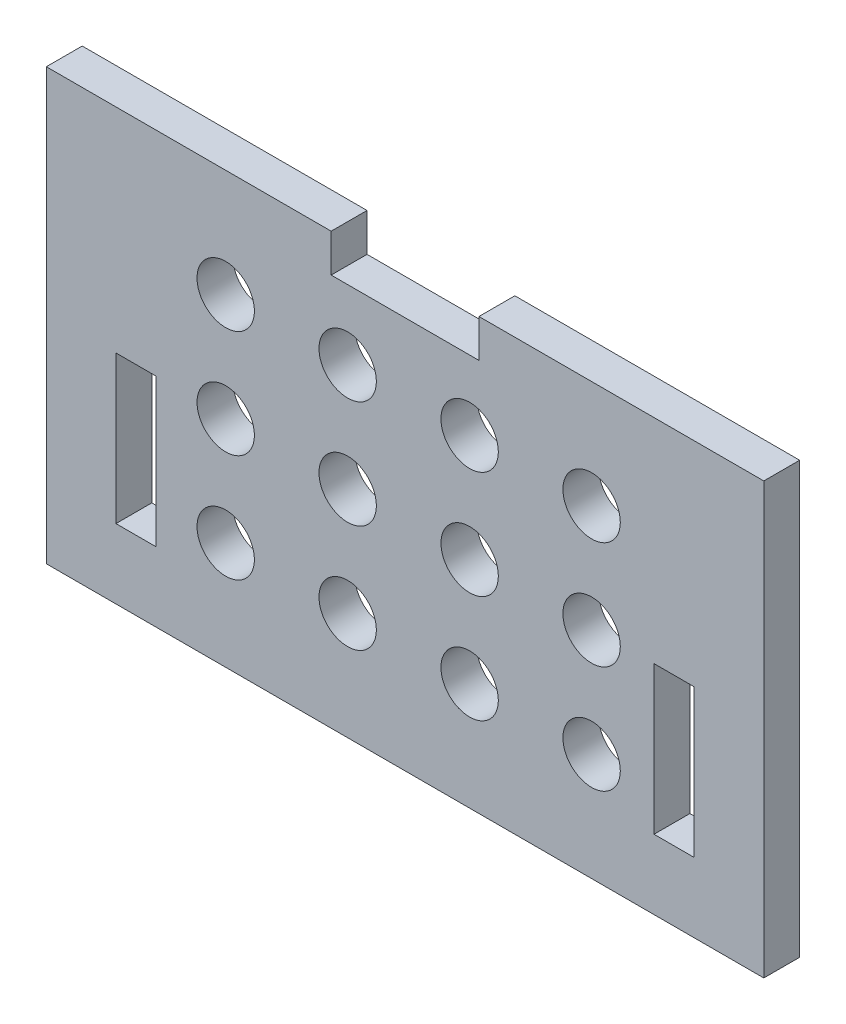
ISO-10303-21;
HEADER;
FILE_DESCRIPTION(('STEP AP214'),'2;1');
FILE_NAME('part.step','',(''),(''),'','','');
FILE_SCHEMA(('AUTOMOTIVE_DESIGN { 1 0 10303 214 1 1 1 1 }'));
ENDSEC;
DATA;
#1=APPLICATION_CONTEXT('core data for automotive mechanical design processes');
#2=APPLICATION_PROTOCOL_DEFINITION('international standard','automotive_design',2000,#1);
#3=PRODUCT_CONTEXT('',#1,'mechanical');
#4=PRODUCT('Part','Part','',(#3));
#5=PRODUCT_RELATED_PRODUCT_CATEGORY('part','',(#4));
#6=PRODUCT_DEFINITION_FORMATION('','',#4);
#7=PRODUCT_DEFINITION_CONTEXT('part definition',#1,'design');
#8=PRODUCT_DEFINITION('design','',#6,#7);
#9=PRODUCT_DEFINITION_SHAPE('','',#8);
#10=(LENGTH_UNIT() NAMED_UNIT(*) SI_UNIT(.MILLI.,.METRE.));
#11=(NAMED_UNIT(*) PLANE_ANGLE_UNIT() SI_UNIT($,.RADIAN.));
#12=(NAMED_UNIT(*) SI_UNIT($,.STERADIAN.) SOLID_ANGLE_UNIT());
#13=UNCERTAINTY_MEASURE_WITH_UNIT(LENGTH_MEASURE(1.E-05),#10,'distance_accuracy_value','');
#14=(GEOMETRIC_REPRESENTATION_CONTEXT(3) GLOBAL_UNCERTAINTY_ASSIGNED_CONTEXT((#13)) GLOBAL_UNIT_ASSIGNED_CONTEXT((#10,
#11,#12)) REPRESENTATION_CONTEXT('',''));
#15=CARTESIAN_POINT('',(0.,0.,0.));
#16=DIRECTION('',(0.,0.,1.));
#17=DIRECTION('',(1.,0.,0.));
#18=AXIS2_PLACEMENT_3D('',#15,#16,#17);
#19=CARTESIAN_POINT('',(0.,0.,5.));
#20=DIRECTION('',(0.,0.,-1.));
#21=DIRECTION('',(-1.,0.,0.));
#22=AXIS2_PLACEMENT_3D('',#19,#20,#21);
#23=PLANE('',#22);
#24=CARTESIAN_POINT('',(25.0000000000003,15.,5.));
#25=DIRECTION('',(0.,0.,1.));
#26=DIRECTION('',(1.,0.,0.));
#27=AXIS2_PLACEMENT_3D('',#24,#25,#26);
#28=CIRCLE('',#27,4.);
#29=CARTESIAN_POINT('',(29.0000000000003,15.,5.));
#30=VERTEX_POINT('',#29);
#31=EDGE_CURVE('E314',#30,#30,#28,.T.);
#32=ORIENTED_EDGE('',*,*,#31,.F.);
#33=EDGE_LOOP('',(#32));
#34=FACE_BOUND('',#33,.T.);
#35=CARTESIAN_POINT('',(25.0000000000002,30.,5.));
#36=DIRECTION('',(0.,0.,1.));
#37=DIRECTION('',(1.,0.,0.));
#38=AXIS2_PLACEMENT_3D('',#35,#36,#37);
#39=CIRCLE('',#38,4.);
#40=CARTESIAN_POINT('',(29.0000000000002,30.,5.));
#41=VERTEX_POINT('',#40);
#42=EDGE_CURVE('E326',#41,#41,#39,.T.);
#43=ORIENTED_EDGE('',*,*,#42,.F.);
#44=EDGE_LOOP('',(#43));
#45=FACE_BOUND('',#44,.T.);
#46=CARTESIAN_POINT('',(76.0000000000003,15.,5.));
#47=DIRECTION('',(0.,0.,1.));
#48=DIRECTION('',(1.,0.,0.));
#49=AXIS2_PLACEMENT_3D('',#46,#47,#48);
#50=CIRCLE('',#49,3.99999999999999);
#51=CARTESIAN_POINT('',(80.0000000000003,15.,5.));
#52=VERTEX_POINT('',#51);
#53=EDGE_CURVE('E333',#52,#52,#50,.T.);
#54=ORIENTED_EDGE('',*,*,#53,.F.);
#55=EDGE_LOOP('',(#54));
#56=FACE_BOUND('',#55,.T.);
#57=CARTESIAN_POINT('',(59.0000000000003,15.,5.));
#58=DIRECTION('',(0.,0.,1.));
#59=DIRECTION('',(1.,0.,0.));
#60=AXIS2_PLACEMENT_3D('',#57,#58,#59);
#61=CIRCLE('',#60,4.00000000000001);
#62=CARTESIAN_POINT('',(63.0000000000003,15.,5.));
#63=VERTEX_POINT('',#62);
#64=EDGE_CURVE('E341',#63,#63,#61,.T.);
#65=ORIENTED_EDGE('',*,*,#64,.F.);
#66=EDGE_LOOP('',(#65));
#67=FACE_BOUND('',#66,.T.);
#68=CARTESIAN_POINT('',(42.0000000000003,15.,5.));
#69=DIRECTION('',(0.,0.,1.));
#70=DIRECTION('',(1.,0.,0.));
#71=AXIS2_PLACEMENT_3D('',#68,#69,#70);
#72=CIRCLE('',#71,4.00000000000001);
#73=CARTESIAN_POINT('',(46.0000000000003,15.,5.));
#74=VERTEX_POINT('',#73);
#75=EDGE_CURVE('E352',#74,#74,#72,.T.);
#76=ORIENTED_EDGE('',*,*,#75,.F.);
#77=EDGE_LOOP('',(#76));
#78=FACE_BOUND('',#77,.T.);
#79=CARTESIAN_POINT('',(76.0000000000002,30.,5.));
#80=DIRECTION('',(0.,0.,1.));
#81=DIRECTION('',(1.,0.,0.));
#82=AXIS2_PLACEMENT_3D('',#79,#80,#81);
#83=CIRCLE('',#82,4.00000000000001);
#84=CARTESIAN_POINT('',(80.0000000000002,30.,5.));
#85=VERTEX_POINT('',#84);
#86=EDGE_CURVE('E359',#85,#85,#83,.T.);
#87=ORIENTED_EDGE('',*,*,#86,.F.);
#88=EDGE_LOOP('',(#87));
#89=FACE_BOUND('',#88,.T.);
#90=CARTESIAN_POINT('',(59.0000000000002,30.,5.));
#91=DIRECTION('',(0.,0.,1.));
#92=DIRECTION('',(1.,0.,0.));
#93=AXIS2_PLACEMENT_3D('',#90,#91,#92);
#94=CIRCLE('',#93,4.);
#95=CARTESIAN_POINT('',(63.0000000000002,30.,5.));
#96=VERTEX_POINT('',#95);
#97=EDGE_CURVE('E367',#96,#96,#94,.T.);
#98=ORIENTED_EDGE('',*,*,#97,.F.);
#99=EDGE_LOOP('',(#98));
#100=FACE_BOUND('',#99,.T.);
#101=CARTESIAN_POINT('',(42.0000000000002,30.,5.));
#102=DIRECTION('',(0.,0.,1.));
#103=DIRECTION('',(1.,0.,0.));
#104=AXIS2_PLACEMENT_3D('',#101,#102,#103);
#105=CIRCLE('',#104,4.);
#106=CARTESIAN_POINT('',(46.0000000000001,30.,5.));
#107=VERTEX_POINT('',#106);
#108=EDGE_CURVE('E378',#107,#107,#105,.T.);
#109=ORIENTED_EDGE('',*,*,#108,.F.);
#110=EDGE_LOOP('',(#109));
#111=FACE_BOUND('',#110,.T.);
#112=CARTESIAN_POINT('',(76.,45.,5.));
#113=DIRECTION('',(0.,0.,1.));
#114=DIRECTION('',(1.,0.,0.));
#115=AXIS2_PLACEMENT_3D('',#112,#113,#114);
#116=CIRCLE('',#115,3.99999999999999);
#117=CARTESIAN_POINT('',(80.,45.,5.));
#118=VERTEX_POINT('',#117);
#119=EDGE_CURVE('E385',#118,#118,#116,.T.);
#120=ORIENTED_EDGE('',*,*,#119,.F.);
#121=EDGE_LOOP('',(#120));
#122=FACE_BOUND('',#121,.T.);
#123=CARTESIAN_POINT('',(59.,45.,5.));
#124=DIRECTION('',(0.,0.,1.));
#125=DIRECTION('',(1.,0.,0.));
#126=AXIS2_PLACEMENT_3D('',#123,#124,#125);
#127=CIRCLE('',#126,4.00000000000001);
#128=CARTESIAN_POINT('',(63.,45.,5.));
#129=VERTEX_POINT('',#128);
#130=EDGE_CURVE('E393',#129,#129,#127,.T.);
#131=ORIENTED_EDGE('',*,*,#130,.F.);
#132=EDGE_LOOP('',(#131));
#133=FACE_BOUND('',#132,.T.);
#134=CARTESIAN_POINT('',(42.,45.,5.));
#135=DIRECTION('',(0.,0.,1.));
#136=DIRECTION('',(1.,0.,0.));
#137=AXIS2_PLACEMENT_3D('',#134,#135,#136);
#138=CIRCLE('',#137,4.00000000000001);
#139=CARTESIAN_POINT('',(46.,45.,5.));
#140=VERTEX_POINT('',#139);
#141=EDGE_CURVE('E404',#140,#140,#138,.T.);
#142=ORIENTED_EDGE('',*,*,#141,.F.);
#143=EDGE_LOOP('',(#142));
#144=FACE_BOUND('',#143,.T.);
#145=DIRECTION('',(-1.,0.,0.));
#146=VECTOR('',#145,1.);
#147=CARTESIAN_POINT('',(9.7,30.3,5.));
#148=LINE('',#147,#146);
#149=CARTESIAN_POINT('',(15.3,30.3,5.));
#150=VERTEX_POINT('',#149);
#151=CARTESIAN_POINT('',(9.7,30.3,5.));
#152=VERTEX_POINT('',#151);
#153=EDGE_CURVE('E411',#150,#152,#148,.T.);
#154=ORIENTED_EDGE('',*,*,#153,.F.);
#155=DIRECTION('',(0.,1.,0.));
#156=VECTOR('',#155,1.);
#157=CARTESIAN_POINT('',(15.3,30.3,5.));
#158=LINE('',#157,#156);
#159=CARTESIAN_POINT('',(15.3,9.7,5.));
#160=VERTEX_POINT('',#159);
#161=EDGE_CURVE('E423',#160,#150,#158,.T.);
#162=ORIENTED_EDGE('',*,*,#161,.F.);
#163=DIRECTION('',(1.,0.,0.));
#164=VECTOR('',#163,1.);
#165=CARTESIAN_POINT('',(9.7,9.7,5.));
#166=LINE('',#165,#164);
#167=CARTESIAN_POINT('',(9.7,9.7,5.));
#168=VERTEX_POINT('',#167);
#169=EDGE_CURVE('E418',#168,#160,#166,.T.);
#170=ORIENTED_EDGE('',*,*,#169,.F.);
#171=DIRECTION('',(0.,-1.,0.));
#172=VECTOR('',#171,1.);
#173=CARTESIAN_POINT('',(9.7,30.3,5.));
#174=LINE('',#173,#172);
#175=EDGE_CURVE('E414',#152,#168,#174,.T.);
#176=ORIENTED_EDGE('',*,*,#175,.F.);
#177=EDGE_LOOP('',(#154,#162,#170,#176));
#178=FACE_BOUND('',#177,.T.);
#179=DIRECTION('',(0.,-1.,0.));
#180=VECTOR('',#179,1.);
#181=CARTESIAN_POINT('',(0.,0.,5.));
#182=LINE('',#181,#180);
#183=CARTESIAN_POINT('',(0.,60.,5.));
#184=VERTEX_POINT('',#183);
#185=CARTESIAN_POINT('',(0.,0.,5.));
#186=VERTEX_POINT('',#185);
#187=EDGE_CURVE('E202',#184,#186,#182,.T.);
#188=ORIENTED_EDGE('',*,*,#187,.T.);
#189=DIRECTION('',(1.,0.,0.));
#190=VECTOR('',#189,1.);
#191=CARTESIAN_POINT('',(0.,0.,5.));
#192=LINE('',#191,#190);
#193=CARTESIAN_POINT('',(100.,0.,5.));
#194=VERTEX_POINT('',#193);
#195=EDGE_CURVE('E207',#186,#194,#192,.T.);
#196=ORIENTED_EDGE('',*,*,#195,.T.);
#197=DIRECTION('',(0.,1.,0.));
#198=VECTOR('',#197,1.);
#199=CARTESIAN_POINT('',(100.,0.,5.));
#200=LINE('',#199,#198);
#201=CARTESIAN_POINT('',(100.,60.,5.));
#202=VERTEX_POINT('',#201);
#203=EDGE_CURVE('E220',#194,#202,#200,.T.);
#204=ORIENTED_EDGE('',*,*,#203,.T.);
#205=DIRECTION('',(-1.,0.,0.));
#206=VECTOR('',#205,1.);
#207=CARTESIAN_POINT('',(60.3,60.,5.));
#208=LINE('',#207,#206);
#209=CARTESIAN_POINT('',(60.3,60.,5.));
#210=VERTEX_POINT('',#209);
#211=EDGE_CURVE('E223',#202,#210,#208,.T.);
#212=ORIENTED_EDGE('',*,*,#211,.T.);
#213=DIRECTION('',(0.,-1.,0.));
#214=VECTOR('',#213,1.);
#215=CARTESIAN_POINT('',(60.3,60.,5.));
#216=LINE('',#215,#214);
#217=CARTESIAN_POINT('',(60.3,54.7,5.));
#218=VERTEX_POINT('',#217);
#219=EDGE_CURVE('E227',#210,#218,#216,.T.);
#220=ORIENTED_EDGE('',*,*,#219,.T.);
#221=DIRECTION('',(-1.,0.,0.));
#222=VECTOR('',#221,1.);
#223=CARTESIAN_POINT('',(39.7,54.7,5.));
#224=LINE('',#223,#222);
#225=CARTESIAN_POINT('',(39.7,54.7,5.));
#226=VERTEX_POINT('',#225);
#227=EDGE_CURVE('E231',#218,#226,#224,.T.);
#228=ORIENTED_EDGE('',*,*,#227,.T.);
#229=DIRECTION('',(0.,1.,0.));
#230=VECTOR('',#229,1.);
#231=CARTESIAN_POINT('',(39.7,60.,5.));
#232=LINE('',#231,#230);
#233=CARTESIAN_POINT('',(39.7,60.,5.));
#234=VERTEX_POINT('',#233);
#235=EDGE_CURVE('E235',#226,#234,#232,.T.);
#236=ORIENTED_EDGE('',*,*,#235,.T.);
#237=DIRECTION('',(-1.,0.,0.));
#238=VECTOR('',#237,1.);
#239=CARTESIAN_POINT('',(0.,60.,5.));
#240=LINE('',#239,#238);
#241=EDGE_CURVE('E238',#234,#184,#240,.T.);
#242=ORIENTED_EDGE('',*,*,#241,.T.);
#243=EDGE_LOOP('',(#188,#196,#204,#212,#220,#228,#236,#242));
#244=FACE_BOUND('',#243,.T.);
#245=CARTESIAN_POINT('',(25.,45.,5.));
#246=DIRECTION('',(0.,0.,1.));
#247=DIRECTION('',(1.,0.,0.));
#248=AXIS2_PLACEMENT_3D('',#245,#246,#247);
#249=CIRCLE('',#248,4.);
#250=CARTESIAN_POINT('',(29.,45.,5.));
#251=VERTEX_POINT('',#250);
#252=EDGE_CURVE('E190',#251,#251,#249,.T.);
#253=ORIENTED_EDGE('',*,*,#252,.F.);
#254=EDGE_LOOP('',(#253));
#255=FACE_BOUND('',#254,.T.);
#256=DIRECTION('',(0.,1.,0.));
#257=VECTOR('',#256,1.);
#258=CARTESIAN_POINT('',(90.3,30.3,5.));
#259=LINE('',#258,#257);
#260=CARTESIAN_POINT('',(90.3,9.7,5.));
#261=VERTEX_POINT('',#260);
#262=CARTESIAN_POINT('',(90.3,30.3,5.));
#263=VERTEX_POINT('',#262);
#264=EDGE_CURVE('E151',#261,#263,#259,.T.);
#265=ORIENTED_EDGE('',*,*,#264,.F.);
#266=DIRECTION('',(1.,0.,0.));
#267=VECTOR('',#266,1.);
#268=CARTESIAN_POINT('',(90.3,9.7,5.));
#269=LINE('',#268,#267);
#270=CARTESIAN_POINT('',(84.7,9.7,5.));
#271=VERTEX_POINT('',#270);
#272=EDGE_CURVE('E175',#271,#261,#269,.T.);
#273=ORIENTED_EDGE('',*,*,#272,.F.);
#274=DIRECTION('',(0.,-1.,0.));
#275=VECTOR('',#274,1.);
#276=CARTESIAN_POINT('',(84.7,30.3,5.));
#277=LINE('',#276,#275);
#278=CARTESIAN_POINT('',(84.7,30.3,5.));
#279=VERTEX_POINT('',#278);
#280=EDGE_CURVE('E172',#279,#271,#277,.T.);
#281=ORIENTED_EDGE('',*,*,#280,.F.);
#282=DIRECTION('',(-1.,0.,0.));
#283=VECTOR('',#282,1.);
#284=CARTESIAN_POINT('',(90.3,30.3,5.));
#285=LINE('',#284,#283);
#286=EDGE_CURVE('E160',#263,#279,#285,.T.);
#287=ORIENTED_EDGE('',*,*,#286,.F.);
#288=EDGE_LOOP('',(#265,#273,#281,#287));
#289=FACE_BOUND('',#288,.T.);
#290=ADVANCED_FACE('F38',(#34,#45,#56,#67,#78,#89,#100,#111,#122,#133,#144,#178,#244,#255,#289),
#23,.F.);
#291=CARTESIAN_POINT('',(0.,0.,0.));
#292=DIRECTION('',(0.,0.,-1.));
#293=DIRECTION('',(-1.,0.,0.));
#294=AXIS2_PLACEMENT_3D('',#291,#292,#293);
#295=PLANE('',#294);
#296=CARTESIAN_POINT('',(25.0000000000002,30.,0.));
#297=DIRECTION('',(0.,0.,1.));
#298=DIRECTION('',(1.,0.,0.));
#299=AXIS2_PLACEMENT_3D('',#296,#297,#298);
#300=CIRCLE('',#299,4.);
#301=CARTESIAN_POINT('',(29.0000000000002,30.,0.));
#302=VERTEX_POINT('',#301);
#303=EDGE_CURVE('E319',#302,#302,#300,.T.);
#304=ORIENTED_EDGE('',*,*,#303,.T.);
#305=EDGE_LOOP('',(#304));
#306=FACE_BOUND('',#305,.T.);
#307=CARTESIAN_POINT('',(59.0000000000003,15.,0.));
#308=DIRECTION('',(0.,0.,1.));
#309=DIRECTION('',(1.,0.,0.));
#310=AXIS2_PLACEMENT_3D('',#307,#308,#309);
#311=CIRCLE('',#310,4.00000000000001);
#312=CARTESIAN_POINT('',(63.0000000000003,15.,0.));
#313=VERTEX_POINT('',#312);
#314=EDGE_CURVE('E338',#313,#313,#311,.T.);
#315=ORIENTED_EDGE('',*,*,#314,.T.);
#316=EDGE_LOOP('',(#315));
#317=FACE_BOUND('',#316,.T.);
#318=CARTESIAN_POINT('',(76.0000000000002,30.,0.));
#319=DIRECTION('',(0.,0.,1.));
#320=DIRECTION('',(1.,0.,0.));
#321=AXIS2_PLACEMENT_3D('',#318,#319,#320);
#322=CIRCLE('',#321,4.00000000000001);
#323=CARTESIAN_POINT('',(80.0000000000002,30.,0.));
#324=VERTEX_POINT('',#323);
#325=EDGE_CURVE('E357',#324,#324,#322,.T.);
#326=ORIENTED_EDGE('',*,*,#325,.T.);
#327=EDGE_LOOP('',(#326));
#328=FACE_BOUND('',#327,.T.);
#329=CARTESIAN_POINT('',(42.0000000000002,30.,0.));
#330=DIRECTION('',(0.,0.,1.));
#331=DIRECTION('',(1.,0.,0.));
#332=AXIS2_PLACEMENT_3D('',#329,#330,#331);
#333=CIRCLE('',#332,4.);
#334=CARTESIAN_POINT('',(46.0000000000001,30.,0.));
#335=VERTEX_POINT('',#334);
#336=EDGE_CURVE('E372',#335,#335,#333,.T.);
#337=ORIENTED_EDGE('',*,*,#336,.T.);
#338=EDGE_LOOP('',(#337));
#339=FACE_BOUND('',#338,.T.);
#340=CARTESIAN_POINT('',(59.,45.,0.));
#341=DIRECTION('',(0.,0.,1.));
#342=DIRECTION('',(1.,0.,0.));
#343=AXIS2_PLACEMENT_3D('',#340,#341,#342);
#344=CIRCLE('',#343,4.00000000000001);
#345=CARTESIAN_POINT('',(63.,45.,0.));
#346=VERTEX_POINT('',#345);
#347=EDGE_CURVE('E390',#346,#346,#344,.T.);
#348=ORIENTED_EDGE('',*,*,#347,.T.);
#349=EDGE_LOOP('',(#348));
#350=FACE_BOUND('',#349,.T.);
#351=DIRECTION('',(0.,1.,0.));
#352=VECTOR('',#351,1.);
#353=CARTESIAN_POINT('',(15.3,30.3,0.));
#354=LINE('',#353,#352);
#355=CARTESIAN_POINT('',(15.3,9.7,0.));
#356=VERTEX_POINT('',#355);
#357=CARTESIAN_POINT('',(15.3,30.3,0.));
#358=VERTEX_POINT('',#357);
#359=EDGE_CURVE('E415',#356,#358,#354,.T.);
#360=ORIENTED_EDGE('',*,*,#359,.T.);
#361=DIRECTION('',(-1.,0.,0.));
#362=VECTOR('',#361,1.);
#363=CARTESIAN_POINT('',(9.7,30.3,0.));
#364=LINE('',#363,#362);
#365=CARTESIAN_POINT('',(9.7,30.3,0.));
#366=VERTEX_POINT('',#365);
#367=EDGE_CURVE('E409',#358,#366,#364,.T.);
#368=ORIENTED_EDGE('',*,*,#367,.T.);
#369=DIRECTION('',(0.,-1.,0.));
#370=VECTOR('',#369,1.);
#371=CARTESIAN_POINT('',(9.7,30.3,0.));
#372=LINE('',#371,#370);
#373=CARTESIAN_POINT('',(9.7,9.7,0.));
#374=VERTEX_POINT('',#373);
#375=EDGE_CURVE('E430',#366,#374,#372,.T.);
#376=ORIENTED_EDGE('',*,*,#375,.T.);
#377=DIRECTION('',(1.,0.,0.));
#378=VECTOR('',#377,1.);
#379=CARTESIAN_POINT('',(9.7,9.7,0.));
#380=LINE('',#379,#378);
#381=EDGE_CURVE('E433',#374,#356,#380,.T.);
#382=ORIENTED_EDGE('',*,*,#381,.T.);
#383=EDGE_LOOP('',(#360,#368,#376,#382));
#384=FACE_BOUND('',#383,.T.);
#385=CARTESIAN_POINT('',(25.,45.,0.));
#386=DIRECTION('',(0.,0.,1.));
#387=DIRECTION('',(1.,0.,0.));
#388=AXIS2_PLACEMENT_3D('',#385,#386,#387);
#389=CIRCLE('',#388,4.);
#390=CARTESIAN_POINT('',(29.,45.,0.));
#391=VERTEX_POINT('',#390);
#392=EDGE_CURVE('E197',#391,#391,#389,.T.);
#393=ORIENTED_EDGE('',*,*,#392,.T.);
#394=EDGE_LOOP('',(#393));
#395=FACE_BOUND('',#394,.T.);
#396=DIRECTION('',(0.,-1.,0.));
#397=VECTOR('',#396,1.);
#398=CARTESIAN_POINT('',(0.,0.,0.));
#399=LINE('',#398,#397);
#400=CARTESIAN_POINT('',(0.,60.,0.));
#401=VERTEX_POINT('',#400);
#402=CARTESIAN_POINT('',(0.,0.,0.));
#403=VERTEX_POINT('',#402);
#404=EDGE_CURVE('E196',#401,#403,#399,.T.);
#405=ORIENTED_EDGE('',*,*,#404,.F.);
#406=DIRECTION('',(-1.,0.,0.));
#407=VECTOR('',#406,1.);
#408=CARTESIAN_POINT('',(0.,60.,0.));
#409=LINE('',#408,#407);
#410=CARTESIAN_POINT('',(39.7,60.,0.));
#411=VERTEX_POINT('',#410);
#412=EDGE_CURVE('E208',#411,#401,#409,.T.);
#413=ORIENTED_EDGE('',*,*,#412,.F.);
#414=DIRECTION('',(0.,1.,0.));
#415=VECTOR('',#414,1.);
#416=CARTESIAN_POINT('',(39.7,60.,0.));
#417=LINE('',#416,#415);
#418=CARTESIAN_POINT('',(39.7,54.7,0.));
#419=VERTEX_POINT('',#418);
#420=EDGE_CURVE('E255',#419,#411,#417,.T.);
#421=ORIENTED_EDGE('',*,*,#420,.F.);
#422=DIRECTION('',(-1.,0.,0.));
#423=VECTOR('',#422,1.);
#424=CARTESIAN_POINT('',(39.7,54.7,0.));
#425=LINE('',#424,#423);
#426=CARTESIAN_POINT('',(60.3,54.7,0.));
#427=VERTEX_POINT('',#426);
#428=EDGE_CURVE('E253',#427,#419,#425,.T.);
#429=ORIENTED_EDGE('',*,*,#428,.F.);
#430=DIRECTION('',(0.,-1.,0.));
#431=VECTOR('',#430,1.);
#432=CARTESIAN_POINT('',(60.3,60.,0.));
#433=LINE('',#432,#431);
#434=CARTESIAN_POINT('',(60.3,60.,0.));
#435=VERTEX_POINT('',#434);
#436=EDGE_CURVE('E251',#435,#427,#433,.T.);
#437=ORIENTED_EDGE('',*,*,#436,.F.);
#438=DIRECTION('',(-1.,0.,0.));
#439=VECTOR('',#438,1.);
#440=CARTESIAN_POINT('',(60.3,60.,0.));
#441=LINE('',#440,#439);
#442=CARTESIAN_POINT('',(100.,60.,0.));
#443=VERTEX_POINT('',#442);
#444=EDGE_CURVE('E249',#443,#435,#441,.T.);
#445=ORIENTED_EDGE('',*,*,#444,.F.);
#446=DIRECTION('',(0.,1.,0.));
#447=VECTOR('',#446,1.);
#448=CARTESIAN_POINT('',(100.,0.,0.));
#449=LINE('',#448,#447);
#450=CARTESIAN_POINT('',(100.,0.,0.));
#451=VERTEX_POINT('',#450);
#452=EDGE_CURVE('E247',#451,#443,#449,.T.);
#453=ORIENTED_EDGE('',*,*,#452,.F.);
#454=DIRECTION('',(1.,0.,0.));
#455=VECTOR('',#454,1.);
#456=CARTESIAN_POINT('',(0.,0.,0.));
#457=LINE('',#456,#455);
#458=EDGE_CURVE('E245',#403,#451,#457,.T.);
#459=ORIENTED_EDGE('',*,*,#458,.F.);
#460=EDGE_LOOP('',(#405,#413,#421,#429,#437,#445,#453,#459));
#461=FACE_BOUND('',#460,.T.);
#462=CARTESIAN_POINT('',(42.,45.,0.));
#463=DIRECTION('',(0.,0.,1.));
#464=DIRECTION('',(1.,0.,0.));
#465=AXIS2_PLACEMENT_3D('',#462,#463,#464);
#466=CIRCLE('',#465,4.00000000000001);
#467=CARTESIAN_POINT('',(46.,45.,0.));
#468=VERTEX_POINT('',#467);
#469=EDGE_CURVE('E398',#468,#468,#466,.T.);
#470=ORIENTED_EDGE('',*,*,#469,.T.);
#471=EDGE_LOOP('',(#470));
#472=FACE_BOUND('',#471,.T.);
#473=CARTESIAN_POINT('',(76.,45.,0.));
#474=DIRECTION('',(0.,0.,1.));
#475=DIRECTION('',(1.,0.,0.));
#476=AXIS2_PLACEMENT_3D('',#473,#474,#475);
#477=CIRCLE('',#476,3.99999999999999);
#478=CARTESIAN_POINT('',(80.,45.,0.));
#479=VERTEX_POINT('',#478);
#480=EDGE_CURVE('E383',#479,#479,#477,.T.);
#481=ORIENTED_EDGE('',*,*,#480,.T.);
#482=EDGE_LOOP('',(#481));
#483=FACE_BOUND('',#482,.T.);
#484=CARTESIAN_POINT('',(59.0000000000002,30.,0.));
#485=DIRECTION('',(0.,0.,1.));
#486=DIRECTION('',(1.,0.,0.));
#487=AXIS2_PLACEMENT_3D('',#484,#485,#486);
#488=CIRCLE('',#487,4.);
#489=CARTESIAN_POINT('',(63.0000000000002,30.,0.));
#490=VERTEX_POINT('',#489);
#491=EDGE_CURVE('E364',#490,#490,#488,.T.);
#492=ORIENTED_EDGE('',*,*,#491,.T.);
#493=EDGE_LOOP('',(#492));
#494=FACE_BOUND('',#493,.T.);
#495=CARTESIAN_POINT('',(42.0000000000003,15.,0.));
#496=DIRECTION('',(0.,0.,1.));
#497=DIRECTION('',(1.,0.,0.));
#498=AXIS2_PLACEMENT_3D('',#495,#496,#497);
#499=CIRCLE('',#498,4.00000000000001);
#500=CARTESIAN_POINT('',(46.0000000000003,15.,0.));
#501=VERTEX_POINT('',#500);
#502=EDGE_CURVE('E346',#501,#501,#499,.T.);
#503=ORIENTED_EDGE('',*,*,#502,.T.);
#504=EDGE_LOOP('',(#503));
#505=FACE_BOUND('',#504,.T.);
#506=CARTESIAN_POINT('',(76.0000000000003,15.,0.));
#507=DIRECTION('',(0.,0.,1.));
#508=DIRECTION('',(1.,0.,0.));
#509=AXIS2_PLACEMENT_3D('',#506,#507,#508);
#510=CIRCLE('',#509,3.99999999999999);
#511=CARTESIAN_POINT('',(80.0000000000003,15.,0.));
#512=VERTEX_POINT('',#511);
#513=EDGE_CURVE('E331',#512,#512,#510,.T.);
#514=ORIENTED_EDGE('',*,*,#513,.T.);
#515=EDGE_LOOP('',(#514));
#516=FACE_BOUND('',#515,.T.);
#517=CARTESIAN_POINT('',(25.0000000000003,15.,0.));
#518=DIRECTION('',(0.,0.,1.));
#519=DIRECTION('',(1.,0.,0.));
#520=AXIS2_PLACEMENT_3D('',#517,#518,#519);
#521=CIRCLE('',#520,4.);
#522=CARTESIAN_POINT('',(29.0000000000003,15.,0.));
#523=VERTEX_POINT('',#522);
#524=EDGE_CURVE('E168',#523,#523,#521,.T.);
#525=ORIENTED_EDGE('',*,*,#524,.T.);
#526=EDGE_LOOP('',(#525));
#527=FACE_BOUND('',#526,.T.);
#528=DIRECTION('',(1.,0.,0.));
#529=VECTOR('',#528,1.);
#530=CARTESIAN_POINT('',(90.3,9.7,0.));
#531=LINE('',#530,#529);
#532=CARTESIAN_POINT('',(84.7,9.7,0.));
#533=VERTEX_POINT('',#532);
#534=CARTESIAN_POINT('',(90.3,9.7,0.));
#535=VERTEX_POINT('',#534);
#536=EDGE_CURVE('E161',#533,#535,#531,.T.);
#537=ORIENTED_EDGE('',*,*,#536,.T.);
#538=DIRECTION('',(0.,1.,0.));
#539=VECTOR('',#538,1.);
#540=CARTESIAN_POINT('',(90.3,30.3,0.));
#541=LINE('',#540,#539);
#542=CARTESIAN_POINT('',(90.3,30.3,0.));
#543=VERTEX_POINT('',#542);
#544=EDGE_CURVE('E61',#535,#543,#541,.T.);
#545=ORIENTED_EDGE('',*,*,#544,.T.);
#546=DIRECTION('',(-1.,0.,0.));
#547=VECTOR('',#546,1.);
#548=CARTESIAN_POINT('',(90.3,30.3,0.));
#549=LINE('',#548,#547);
#550=CARTESIAN_POINT('',(84.7,30.3,0.));
#551=VERTEX_POINT('',#550);
#552=EDGE_CURVE('E167',#543,#551,#549,.T.);
#553=ORIENTED_EDGE('',*,*,#552,.T.);
#554=DIRECTION('',(0.,-1.,0.));
#555=VECTOR('',#554,1.);
#556=CARTESIAN_POINT('',(84.7,30.3,0.));
#557=LINE('',#556,#555);
#558=EDGE_CURVE('E745',#551,#533,#557,.T.);
#559=ORIENTED_EDGE('',*,*,#558,.T.);
#560=EDGE_LOOP('',(#537,#545,#553,#559));
#561=FACE_BOUND('',#560,.T.);
#562=ADVANCED_FACE('F285',(#306,#317,#328,#339,#350,#384,#395,#461,#472,#483,#494,#505,#516,
#527,#561),#295,.T.);
#563=CARTESIAN_POINT('',(0.,0.,5.));
#564=DIRECTION('',(1.,0.,0.));
#565=DIRECTION('',(0.,0.,-1.));
#566=AXIS2_PLACEMENT_3D('',#563,#564,#565);
#567=PLANE('',#566);
#568=ORIENTED_EDGE('',*,*,#404,.T.);
#569=DIRECTION('',(0.,0.,-1.));
#570=VECTOR('',#569,1.);
#571=CARTESIAN_POINT('',(0.,0.,5.));
#572=LINE('',#571,#570);
#573=EDGE_CURVE('E12',#186,#403,#572,.T.);
#574=ORIENTED_EDGE('',*,*,#573,.F.);
#575=ORIENTED_EDGE('',*,*,#187,.F.);
#576=DIRECTION('',(0.,0.,-1.));
#577=VECTOR('',#576,1.);
#578=CARTESIAN_POINT('',(0.,60.,5.));
#579=LINE('',#578,#577);
#580=EDGE_CURVE('E242',#184,#401,#579,.T.);
#581=ORIENTED_EDGE('',*,*,#580,.T.);
#582=EDGE_LOOP('',(#568,#574,#575,#581));
#583=FACE_BOUND('',#582,.T.);
#584=ADVANCED_FACE('F40',(#583),#567,.F.);
#585=CARTESIAN_POINT('',(0.,0.,5.));
#586=DIRECTION('',(0.,1.,0.));
#587=DIRECTION('',(0.,0.,1.));
#588=AXIS2_PLACEMENT_3D('',#585,#586,#587);
#589=PLANE('',#588);
#590=ORIENTED_EDGE('',*,*,#458,.T.);
#591=DIRECTION('',(0.,0.,-1.));
#592=VECTOR('',#591,1.);
#593=CARTESIAN_POINT('',(100.,0.,5.));
#594=LINE('',#593,#592);
#595=EDGE_CURVE('E46',#194,#451,#594,.T.);
#596=ORIENTED_EDGE('',*,*,#595,.F.);
#597=ORIENTED_EDGE('',*,*,#195,.F.);
#598=ORIENTED_EDGE('',*,*,#573,.T.);
#599=EDGE_LOOP('',(#590,#596,#597,#598));
#600=FACE_BOUND('',#599,.T.);
#601=ADVANCED_FACE('F503',(#600),#589,.F.);
#602=CARTESIAN_POINT('',(100.,0.,5.));
#603=DIRECTION('',(-1.,0.,0.));
#604=DIRECTION('',(0.,-1.,0.));
#605=AXIS2_PLACEMENT_3D('',#602,#603,#604);
#606=PLANE('',#605);
#607=ORIENTED_EDGE('',*,*,#452,.T.);
#608=DIRECTION('',(0.,0.,-1.));
#609=VECTOR('',#608,1.);
#610=CARTESIAN_POINT('',(100.,60.,5.));
#611=LINE('',#610,#609);
#612=EDGE_CURVE('E272',#202,#443,#611,.T.);
#613=ORIENTED_EDGE('',*,*,#612,.F.);
#614=ORIENTED_EDGE('',*,*,#203,.F.);
#615=ORIENTED_EDGE('',*,*,#595,.T.);
#616=EDGE_LOOP('',(#607,#613,#614,#615));
#617=FACE_BOUND('',#616,.T.);
#618=ADVANCED_FACE('F279',(#617),#606,.F.);
#619=CARTESIAN_POINT('',(60.3,60.,5.));
#620=DIRECTION('',(0.,-1.,0.));
#621=DIRECTION('',(1.,0.,0.));
#622=AXIS2_PLACEMENT_3D('',#619,#620,#621);
#623=PLANE('',#622);
#624=ORIENTED_EDGE('',*,*,#444,.T.);
#625=DIRECTION('',(0.,0.,-1.));
#626=VECTOR('',#625,1.);
#627=CARTESIAN_POINT('',(60.3,60.,5.));
#628=LINE('',#627,#626);
#629=EDGE_CURVE('E269',#210,#435,#628,.T.);
#630=ORIENTED_EDGE('',*,*,#629,.F.);
#631=ORIENTED_EDGE('',*,*,#211,.F.);
#632=ORIENTED_EDGE('',*,*,#612,.T.);
#633=EDGE_LOOP('',(#624,#630,#631,#632));
#634=FACE_BOUND('',#633,.T.);
#635=ADVANCED_FACE('F291',(#634),#623,.F.);
#636=CARTESIAN_POINT('',(60.3,60.,5.));
#637=DIRECTION('',(1.,0.,0.));
#638=DIRECTION('',(0.,0.,-1.));
#639=AXIS2_PLACEMENT_3D('',#636,#637,#638);
#640=PLANE('',#639);
#641=ORIENTED_EDGE('',*,*,#436,.T.);
#642=DIRECTION('',(0.,0.,-1.));
#643=VECTOR('',#642,1.);
#644=CARTESIAN_POINT('',(60.3,54.7,5.));
#645=LINE('',#644,#643);
#646=EDGE_CURVE('E266',#218,#427,#645,.T.);
#647=ORIENTED_EDGE('',*,*,#646,.F.);
#648=ORIENTED_EDGE('',*,*,#219,.F.);
#649=ORIENTED_EDGE('',*,*,#629,.T.);
#650=EDGE_LOOP('',(#641,#647,#648,#649));
#651=FACE_BOUND('',#650,.T.);
#652=ADVANCED_FACE('F295',(#651),#640,.F.);
#653=CARTESIAN_POINT('',(39.7,54.7,5.));
#654=DIRECTION('',(0.,-1.,0.));
#655=DIRECTION('',(0.,0.,-1.));
#656=AXIS2_PLACEMENT_3D('',#653,#654,#655);
#657=PLANE('',#656);
#658=ORIENTED_EDGE('',*,*,#428,.T.);
#659=DIRECTION('',(0.,0.,-1.));
#660=VECTOR('',#659,1.);
#661=CARTESIAN_POINT('',(39.7,54.7,5.));
#662=LINE('',#661,#660);
#663=EDGE_CURVE('E263',#226,#419,#662,.T.);
#664=ORIENTED_EDGE('',*,*,#663,.F.);
#665=ORIENTED_EDGE('',*,*,#227,.F.);
#666=ORIENTED_EDGE('',*,*,#646,.T.);
#667=EDGE_LOOP('',(#658,#664,#665,#666));
#668=FACE_BOUND('',#667,.T.);
#669=ADVANCED_FACE('F493',(#668),#657,.F.);
#670=CARTESIAN_POINT('',(39.7,60.,5.));
#671=DIRECTION('',(-1.,0.,0.));
#672=DIRECTION('',(0.,0.,1.));
#673=AXIS2_PLACEMENT_3D('',#670,#671,#672);
#674=PLANE('',#673);
#675=ORIENTED_EDGE('',*,*,#420,.T.);
#676=DIRECTION('',(0.,0.,-1.));
#677=VECTOR('',#676,1.);
#678=CARTESIAN_POINT('',(39.7,60.,5.));
#679=LINE('',#678,#677);
#680=EDGE_CURVE('E260',#234,#411,#679,.T.);
#681=ORIENTED_EDGE('',*,*,#680,.F.);
#682=ORIENTED_EDGE('',*,*,#235,.F.);
#683=ORIENTED_EDGE('',*,*,#663,.T.);
#684=EDGE_LOOP('',(#675,#681,#682,#683));
#685=FACE_BOUND('',#684,.T.);
#686=ADVANCED_FACE('F489',(#685),#674,.F.);
#687=CARTESIAN_POINT('',(0.,60.,5.));
#688=DIRECTION('',(0.,-1.,0.));
#689=DIRECTION('',(0.,0.,-1.));
#690=AXIS2_PLACEMENT_3D('',#687,#688,#689);
#691=PLANE('',#690);
#692=ORIENTED_EDGE('',*,*,#412,.T.);
#693=ORIENTED_EDGE('',*,*,#580,.F.);
#694=ORIENTED_EDGE('',*,*,#241,.F.);
#695=ORIENTED_EDGE('',*,*,#680,.T.);
#696=EDGE_LOOP('',(#692,#693,#694,#695));
#697=FACE_BOUND('',#696,.T.);
#698=ADVANCED_FACE('F486',(#697),#691,.F.);
#699=CARTESIAN_POINT('',(25.,45.,5.));
#700=DIRECTION('',(0.,0.,-1.));
#701=DIRECTION('',(-1.,0.,0.));
#702=AXIS2_PLACEMENT_3D('',#699,#700,#701);
#703=CYLINDRICAL_SURFACE('',#702,4.);
#704=ORIENTED_EDGE('',*,*,#252,.T.);
#705=EDGE_LOOP('',(#704));
#706=FACE_BOUND('',#705,.T.);
#707=ORIENTED_EDGE('',*,*,#392,.F.);
#708=EDGE_LOOP('',(#707));
#709=FACE_BOUND('',#708,.T.);
#710=ADVANCED_FACE('F483',(#706,#709),#703,.F.);
#711=CARTESIAN_POINT('',(9.7,30.3,5.));
#712=DIRECTION('',(0.,-1.,0.));
#713=DIRECTION('',(0.,0.,-1.));
#714=AXIS2_PLACEMENT_3D('',#711,#712,#713);
#715=PLANE('',#714);
#716=ORIENTED_EDGE('',*,*,#367,.F.);
#717=DIRECTION('',(0.,0.,-1.));
#718=VECTOR('',#717,1.);
#719=CARTESIAN_POINT('',(15.3,30.3,5.));
#720=LINE('',#719,#718);
#721=EDGE_CURVE('E427',#150,#358,#720,.T.);
#722=ORIENTED_EDGE('',*,*,#721,.F.);
#723=ORIENTED_EDGE('',*,*,#153,.T.);
#724=DIRECTION('',(0.,0.,-1.));
#725=VECTOR('',#724,1.);
#726=CARTESIAN_POINT('',(9.7,30.3,5.));
#727=LINE('',#726,#725);
#728=EDGE_CURVE('E198',#152,#366,#727,.T.);
#729=ORIENTED_EDGE('',*,*,#728,.T.);
#730=EDGE_LOOP('',(#716,#722,#723,#729));
#731=FACE_BOUND('',#730,.T.);
#732=ADVANCED_FACE('F448',(#731),#715,.T.);
#733=CARTESIAN_POINT('',(9.7,30.3,5.));
#734=DIRECTION('',(1.,0.,0.));
#735=DIRECTION('',(0.,0.,-1.));
#736=AXIS2_PLACEMENT_3D('',#733,#734,#735);
#737=PLANE('',#736);
#738=ORIENTED_EDGE('',*,*,#375,.F.);
#739=ORIENTED_EDGE('',*,*,#728,.F.);
#740=ORIENTED_EDGE('',*,*,#175,.T.);
#741=DIRECTION('',(0.,0.,-1.));
#742=VECTOR('',#741,1.);
#743=CARTESIAN_POINT('',(9.7,9.7,5.));
#744=LINE('',#743,#742);
#745=EDGE_CURVE('E441',#168,#374,#744,.T.);
#746=ORIENTED_EDGE('',*,*,#745,.T.);
#747=EDGE_LOOP('',(#738,#739,#740,#746));
#748=FACE_BOUND('',#747,.T.);
#749=ADVANCED_FACE('F460',(#748),#737,.T.);
#750=CARTESIAN_POINT('',(9.7,9.7,5.));
#751=DIRECTION('',(0.,1.,0.));
#752=DIRECTION('',(0.,0.,1.));
#753=AXIS2_PLACEMENT_3D('',#750,#751,#752);
#754=PLANE('',#753);
#755=ORIENTED_EDGE('',*,*,#381,.F.);
#756=ORIENTED_EDGE('',*,*,#745,.F.);
#757=ORIENTED_EDGE('',*,*,#169,.T.);
#758=DIRECTION('',(0.,0.,-1.));
#759=VECTOR('',#758,1.);
#760=CARTESIAN_POINT('',(15.3,9.7,5.));
#761=LINE('',#760,#759);
#762=EDGE_CURVE('E440',#160,#356,#761,.T.);
#763=ORIENTED_EDGE('',*,*,#762,.T.);
#764=EDGE_LOOP('',(#755,#756,#757,#763));
#765=FACE_BOUND('',#764,.T.);
#766=ADVANCED_FACE('F462',(#765),#754,.T.);
#767=CARTESIAN_POINT('',(15.3,30.3,5.));
#768=DIRECTION('',(-1.,0.,0.));
#769=DIRECTION('',(0.,0.,1.));
#770=AXIS2_PLACEMENT_3D('',#767,#768,#769);
#771=PLANE('',#770);
#772=ORIENTED_EDGE('',*,*,#359,.F.);
#773=ORIENTED_EDGE('',*,*,#762,.F.);
#774=ORIENTED_EDGE('',*,*,#161,.T.);
#775=ORIENTED_EDGE('',*,*,#721,.T.);
#776=EDGE_LOOP('',(#772,#773,#774,#775));
#777=FACE_BOUND('',#776,.T.);
#778=ADVANCED_FACE('F456',(#777),#771,.T.);
#779=CARTESIAN_POINT('',(42.,45.,5.));
#780=DIRECTION('',(0.,0.,-1.));
#781=DIRECTION('',(-1.,0.,0.));
#782=AXIS2_PLACEMENT_3D('',#779,#780,#781);
#783=CYLINDRICAL_SURFACE('',#782,4.00000000000001);
#784=ORIENTED_EDGE('',*,*,#141,.T.);
#785=EDGE_LOOP('',(#784));
#786=FACE_BOUND('',#785,.T.);
#787=ORIENTED_EDGE('',*,*,#469,.F.);
#788=EDGE_LOOP('',(#787));
#789=FACE_BOUND('',#788,.T.);
#790=ADVANCED_FACE('F469',(#786,#789),#783,.F.);
#791=CARTESIAN_POINT('',(59.,45.,5.));
#792=DIRECTION('',(0.,0.,-1.));
#793=DIRECTION('',(-1.,0.,0.));
#794=AXIS2_PLACEMENT_3D('',#791,#792,#793);
#795=CYLINDRICAL_SURFACE('',#794,4.00000000000001);
#796=ORIENTED_EDGE('',*,*,#130,.T.);
#797=EDGE_LOOP('',(#796));
#798=FACE_BOUND('',#797,.T.);
#799=ORIENTED_EDGE('',*,*,#347,.F.);
#800=EDGE_LOOP('',(#799));
#801=FACE_BOUND('',#800,.T.);
#802=ADVANCED_FACE('F604',(#798,#801),#795,.F.);
#803=CARTESIAN_POINT('',(76.,45.,5.));
#804=DIRECTION('',(0.,0.,-1.));
#805=DIRECTION('',(-1.,0.,0.));
#806=AXIS2_PLACEMENT_3D('',#803,#804,#805);
#807=CYLINDRICAL_SURFACE('',#806,3.99999999999999);
#808=ORIENTED_EDGE('',*,*,#119,.T.);
#809=EDGE_LOOP('',(#808));
#810=FACE_BOUND('',#809,.T.);
#811=ORIENTED_EDGE('',*,*,#480,.F.);
#812=EDGE_LOOP('',(#811));
#813=FACE_BOUND('',#812,.T.);
#814=ADVANCED_FACE('F613',(#810,#813),#807,.F.);
#815=CARTESIAN_POINT('',(42.0000000000002,30.,5.));
#816=DIRECTION('',(0.,0.,-1.));
#817=DIRECTION('',(-1.,0.,0.));
#818=AXIS2_PLACEMENT_3D('',#815,#816,#817);
#819=CYLINDRICAL_SURFACE('',#818,4.);
#820=ORIENTED_EDGE('',*,*,#108,.T.);
#821=EDGE_LOOP('',(#820));
#822=FACE_BOUND('',#821,.T.);
#823=ORIENTED_EDGE('',*,*,#336,.F.);
#824=EDGE_LOOP('',(#823));
#825=FACE_BOUND('',#824,.T.);
#826=ADVANCED_FACE('F622',(#822,#825),#819,.F.);
#827=CARTESIAN_POINT('',(59.0000000000002,30.,5.));
#828=DIRECTION('',(0.,0.,-1.));
#829=DIRECTION('',(-1.,0.,0.));
#830=AXIS2_PLACEMENT_3D('',#827,#828,#829);
#831=CYLINDRICAL_SURFACE('',#830,4.);
#832=ORIENTED_EDGE('',*,*,#97,.T.);
#833=EDGE_LOOP('',(#832));
#834=FACE_BOUND('',#833,.T.);
#835=ORIENTED_EDGE('',*,*,#491,.F.);
#836=EDGE_LOOP('',(#835));
#837=FACE_BOUND('',#836,.T.);
#838=ADVANCED_FACE('F631',(#834,#837),#831,.F.);
#839=CARTESIAN_POINT('',(76.0000000000002,30.,5.));
#840=DIRECTION('',(0.,0.,-1.));
#841=DIRECTION('',(-1.,0.,0.));
#842=AXIS2_PLACEMENT_3D('',#839,#840,#841);
#843=CYLINDRICAL_SURFACE('',#842,4.00000000000001);
#844=ORIENTED_EDGE('',*,*,#86,.T.);
#845=EDGE_LOOP('',(#844));
#846=FACE_BOUND('',#845,.T.);
#847=ORIENTED_EDGE('',*,*,#325,.F.);
#848=EDGE_LOOP('',(#847));
#849=FACE_BOUND('',#848,.T.);
#850=ADVANCED_FACE('F640',(#846,#849),#843,.F.);
#851=CARTESIAN_POINT('',(42.0000000000003,15.,5.));
#852=DIRECTION('',(0.,0.,-1.));
#853=DIRECTION('',(-1.,0.,0.));
#854=AXIS2_PLACEMENT_3D('',#851,#852,#853);
#855=CYLINDRICAL_SURFACE('',#854,4.00000000000001);
#856=ORIENTED_EDGE('',*,*,#75,.T.);
#857=EDGE_LOOP('',(#856));
#858=FACE_BOUND('',#857,.T.);
#859=ORIENTED_EDGE('',*,*,#502,.F.);
#860=EDGE_LOOP('',(#859));
#861=FACE_BOUND('',#860,.T.);
#862=ADVANCED_FACE('F649',(#858,#861),#855,.F.);
#863=CARTESIAN_POINT('',(59.0000000000003,15.,5.));
#864=DIRECTION('',(0.,0.,-1.));
#865=DIRECTION('',(-1.,0.,0.));
#866=AXIS2_PLACEMENT_3D('',#863,#864,#865);
#867=CYLINDRICAL_SURFACE('',#866,4.00000000000001);
#868=ORIENTED_EDGE('',*,*,#64,.T.);
#869=EDGE_LOOP('',(#868));
#870=FACE_BOUND('',#869,.T.);
#871=ORIENTED_EDGE('',*,*,#314,.F.);
#872=EDGE_LOOP('',(#871));
#873=FACE_BOUND('',#872,.T.);
#874=ADVANCED_FACE('F658',(#870,#873),#867,.F.);
#875=CARTESIAN_POINT('',(76.0000000000003,15.,5.));
#876=DIRECTION('',(0.,0.,-1.));
#877=DIRECTION('',(-1.,0.,0.));
#878=AXIS2_PLACEMENT_3D('',#875,#876,#877);
#879=CYLINDRICAL_SURFACE('',#878,3.99999999999999);
#880=ORIENTED_EDGE('',*,*,#53,.T.);
#881=EDGE_LOOP('',(#880));
#882=FACE_BOUND('',#881,.T.);
#883=ORIENTED_EDGE('',*,*,#513,.F.);
#884=EDGE_LOOP('',(#883));
#885=FACE_BOUND('',#884,.T.);
#886=ADVANCED_FACE('F667',(#882,#885),#879,.F.);
#887=CARTESIAN_POINT('',(25.0000000000002,30.,5.));
#888=DIRECTION('',(0.,0.,-1.));
#889=DIRECTION('',(-1.,0.,0.));
#890=AXIS2_PLACEMENT_3D('',#887,#888,#889);
#891=CYLINDRICAL_SURFACE('',#890,4.);
#892=ORIENTED_EDGE('',*,*,#42,.T.);
#893=EDGE_LOOP('',(#892));
#894=FACE_BOUND('',#893,.T.);
#895=ORIENTED_EDGE('',*,*,#303,.F.);
#896=EDGE_LOOP('',(#895));
#897=FACE_BOUND('',#896,.T.);
#898=ADVANCED_FACE('F676',(#894,#897),#891,.F.);
#899=CARTESIAN_POINT('',(25.0000000000003,15.,5.));
#900=DIRECTION('',(0.,0.,-1.));
#901=DIRECTION('',(-1.,0.,0.));
#902=AXIS2_PLACEMENT_3D('',#899,#900,#901);
#903=CYLINDRICAL_SURFACE('',#902,4.);
#904=ORIENTED_EDGE('',*,*,#31,.T.);
#905=EDGE_LOOP('',(#904));
#906=FACE_BOUND('',#905,.T.);
#907=ORIENTED_EDGE('',*,*,#524,.F.);
#908=EDGE_LOOP('',(#907));
#909=FACE_BOUND('',#908,.T.);
#910=ADVANCED_FACE('F685',(#906,#909),#903,.F.);
#911=CARTESIAN_POINT('',(90.3,30.3,5.));
#912=DIRECTION('',(-1.,0.,0.));
#913=DIRECTION('',(0.,0.,1.));
#914=AXIS2_PLACEMENT_3D('',#911,#912,#913);
#915=PLANE('',#914);
#916=ORIENTED_EDGE('',*,*,#544,.F.);
#917=DIRECTION('',(0.,0.,-1.));
#918=VECTOR('',#917,1.);
#919=CARTESIAN_POINT('',(90.3,9.7,5.));
#920=LINE('',#919,#918);
#921=EDGE_CURVE('E155',#261,#535,#920,.T.);
#922=ORIENTED_EDGE('',*,*,#921,.F.);
#923=ORIENTED_EDGE('',*,*,#264,.T.);
#924=DIRECTION('',(0.,0.,-1.));
#925=VECTOR('',#924,1.);
#926=CARTESIAN_POINT('',(90.3,30.3,5.));
#927=LINE('',#926,#925);
#928=EDGE_CURVE('E154',#263,#543,#927,.T.);
#929=ORIENTED_EDGE('',*,*,#928,.T.);
#930=EDGE_LOOP('',(#916,#922,#923,#929));
#931=FACE_BOUND('',#930,.T.);
#932=ADVANCED_FACE('F153',(#931),#915,.T.);
#933=CARTESIAN_POINT('',(90.3,30.3,5.));
#934=DIRECTION('',(0.,-1.,0.));
#935=DIRECTION('',(0.,0.,-1.));
#936=AXIS2_PLACEMENT_3D('',#933,#934,#935);
#937=PLANE('',#936);
#938=ORIENTED_EDGE('',*,*,#552,.F.);
#939=ORIENTED_EDGE('',*,*,#928,.F.);
#940=ORIENTED_EDGE('',*,*,#286,.T.);
#941=DIRECTION('',(0.,0.,-1.));
#942=VECTOR('',#941,1.);
#943=CARTESIAN_POINT('',(84.7,30.3,5.));
#944=LINE('',#943,#942);
#945=EDGE_CURVE('E169',#279,#551,#944,.T.);
#946=ORIENTED_EDGE('',*,*,#945,.T.);
#947=EDGE_LOOP('',(#938,#939,#940,#946));
#948=FACE_BOUND('',#947,.T.);
#949=ADVANCED_FACE('F164',(#948),#937,.T.);
#950=CARTESIAN_POINT('',(84.7,30.3,5.));
#951=DIRECTION('',(1.,0.,0.));
#952=DIRECTION('',(0.,0.,-1.));
#953=AXIS2_PLACEMENT_3D('',#950,#951,#952);
#954=PLANE('',#953);
#955=ORIENTED_EDGE('',*,*,#558,.F.);
#956=ORIENTED_EDGE('',*,*,#945,.F.);
#957=ORIENTED_EDGE('',*,*,#280,.T.);
#958=DIRECTION('',(0.,0.,-1.));
#959=VECTOR('',#958,1.);
#960=CARTESIAN_POINT('',(84.7,9.7,5.));
#961=LINE('',#960,#959);
#962=EDGE_CURVE('E53',#271,#533,#961,.T.);
#963=ORIENTED_EDGE('',*,*,#962,.T.);
#964=EDGE_LOOP('',(#955,#956,#957,#963));
#965=FACE_BOUND('',#964,.T.);
#966=ADVANCED_FACE('F709',(#965),#954,.T.);
#967=CARTESIAN_POINT('',(90.3,9.7,5.));
#968=DIRECTION('',(0.,1.,0.));
#969=DIRECTION('',(0.,0.,1.));
#970=AXIS2_PLACEMENT_3D('',#967,#968,#969);
#971=PLANE('',#970);
#972=ORIENTED_EDGE('',*,*,#536,.F.);
#973=ORIENTED_EDGE('',*,*,#962,.F.);
#974=ORIENTED_EDGE('',*,*,#272,.T.);
#975=ORIENTED_EDGE('',*,*,#921,.T.);
#976=EDGE_LOOP('',(#972,#973,#974,#975));
#977=FACE_BOUND('',#976,.T.);
#978=ADVANCED_FACE('F717',(#977),#971,.T.);
#979=CLOSED_SHELL('',(#290,#562,#584,#601,#618,#635,#652,#669,#686,#698,#710,#732,#749,#766,
#778,#790,#802,#814,#826,#838,#850,#862,#874,#886,#898,#910,#932,#949,#966,#978));
#980=MANIFOLD_SOLID_BREP('B2',#979);
#981=ADVANCED_BREP_SHAPE_REPRESENTATION('',(#18,#980),#14);
#982=SHAPE_DEFINITION_REPRESENTATION(#9,#981);
ENDSEC;
END-ISO-10303-21;
